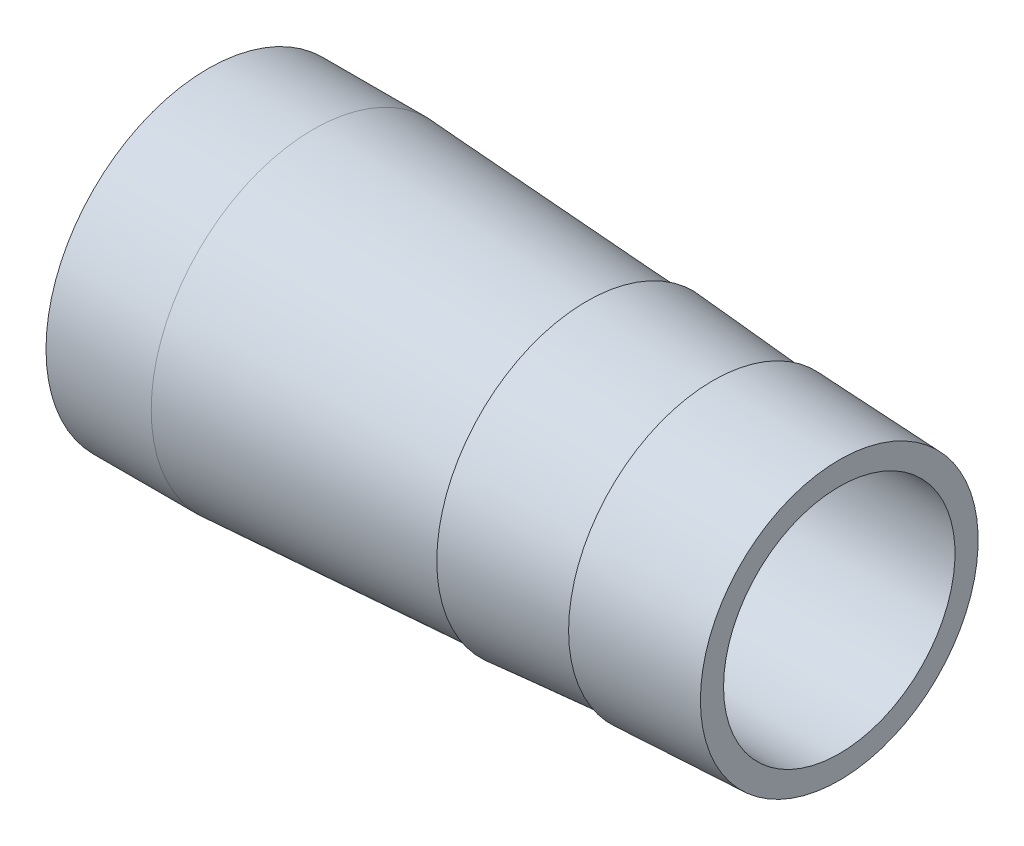
ISO-10303-21;
HEADER;
FILE_DESCRIPTION(('STEP AP214'),'2;1');
FILE_NAME('part.step','',(''),(''),'','','');
FILE_SCHEMA(('AUTOMOTIVE_DESIGN { 1 0 10303 214 1 1 1 1 }'));
ENDSEC;
DATA;
#1=APPLICATION_CONTEXT('core data for automotive mechanical design processes');
#2=APPLICATION_PROTOCOL_DEFINITION('international standard','automotive_design',2000,#1);
#3=PRODUCT_CONTEXT('',#1,'mechanical');
#4=PRODUCT('Part','Part','',(#3));
#5=PRODUCT_RELATED_PRODUCT_CATEGORY('part','',(#4));
#6=PRODUCT_DEFINITION_FORMATION('','',#4);
#7=PRODUCT_DEFINITION_CONTEXT('part definition',#1,'design');
#8=PRODUCT_DEFINITION('design','',#6,#7);
#9=PRODUCT_DEFINITION_SHAPE('','',#8);
#10=(LENGTH_UNIT() NAMED_UNIT(*) SI_UNIT(.MILLI.,.METRE.));
#11=(NAMED_UNIT(*) PLANE_ANGLE_UNIT() SI_UNIT($,.RADIAN.));
#12=(NAMED_UNIT(*) SI_UNIT($,.STERADIAN.) SOLID_ANGLE_UNIT());
#13=UNCERTAINTY_MEASURE_WITH_UNIT(LENGTH_MEASURE(1.E-05),#10,'distance_accuracy_value','');
#14=(GEOMETRIC_REPRESENTATION_CONTEXT(3) GLOBAL_UNCERTAINTY_ASSIGNED_CONTEXT((#13)) GLOBAL_UNIT_ASSIGNED_CONTEXT((#10,
#11,#12)) REPRESENTATION_CONTEXT('',''));
#15=CARTESIAN_POINT('',(0.,0.,0.));
#16=DIRECTION('',(0.,0.,1.));
#17=DIRECTION('',(1.,0.,0.));
#18=AXIS2_PLACEMENT_3D('',#15,#16,#17);
#19=CARTESIAN_POINT('',(13.0257491022955,6.6,0.));
#20=DIRECTION('',(-1.,0.,0.));
#21=DIRECTION('',(0.,0.,1.));
#22=AXIS2_PLACEMENT_3D('',#19,#20,#21);
#23=PLANE('',#22);
#24=CARTESIAN_POINT('',(13.0257491022955,0.,0.));
#25=DIRECTION('',(-1.,0.,0.));
#26=DIRECTION('',(0.,0.,1.));
#27=AXIS2_PLACEMENT_3D('',#24,#25,#26);
#28=CIRCLE('',#27,6.6);
#29=CARTESIAN_POINT('',(13.0257491022955,0.,6.6));
#30=VERTEX_POINT('',#29);
#31=EDGE_CURVE('E10',#30,#30,#28,.T.);
#32=ORIENTED_EDGE('',*,*,#31,.F.);
#33=EDGE_LOOP('',(#32));
#34=FACE_BOUND('',#33,.T.);
#35=CARTESIAN_POINT('',(13.0257491022955,0.,0.));
#36=DIRECTION('',(-1.,0.,0.));
#37=DIRECTION('',(0.,0.,1.));
#38=AXIS2_PLACEMENT_3D('',#35,#36,#37);
#39=CIRCLE('',#38,5.5);
#40=CARTESIAN_POINT('',(13.0257491022955,0.,5.5));
#41=VERTEX_POINT('',#40);
#42=EDGE_CURVE('E63',#41,#41,#39,.T.);
#43=ORIENTED_EDGE('',*,*,#42,.T.);
#44=EDGE_LOOP('',(#43));
#45=FACE_BOUND('',#44,.T.);
#46=ADVANCED_FACE('F32',(#34,#45),#23,.F.);
#47=CARTESIAN_POINT('',(13.0257491022955,0.,0.));
#48=DIRECTION('',(-1.,0.,0.));
#49=DIRECTION('',(0.,0.,1.));
#50=AXIS2_PLACEMENT_3D('',#47,#48,#49);
#51=CONICAL_SURFACE('',#50,6.6,0.0439716382710355);
#52=CARTESIAN_POINT('',(7.0257491022955,0.,0.));
#53=DIRECTION('',(-1.,0.,0.));
#54=DIRECTION('',(0.,0.,1.));
#55=AXIS2_PLACEMENT_3D('',#52,#53,#54);
#56=CIRCLE('',#55,6.864);
#57=CARTESIAN_POINT('',(7.0257491022955,0.,6.864));
#58=VERTEX_POINT('',#57);
#59=EDGE_CURVE('E38',#58,#58,#56,.T.);
#60=ORIENTED_EDGE('',*,*,#59,.F.);
#61=EDGE_LOOP('',(#60));
#62=FACE_BOUND('',#61,.T.);
#63=ORIENTED_EDGE('',*,*,#31,.T.);
#64=EDGE_LOOP('',(#63));
#65=FACE_BOUND('',#64,.T.);
#66=ADVANCED_FACE('F106',(#62,#65),#51,.T.);
#67=CARTESIAN_POINT('',(7.0257491022955,6.864,0.));
#68=DIRECTION('',(1.,0.,0.));
#69=DIRECTION('',(0.,0.,-1.));
#70=AXIS2_PLACEMENT_3D('',#67,#68,#69);
#71=PLANE('',#70);
#72=CARTESIAN_POINT('',(7.0257491022955,0.,0.));
#73=DIRECTION('',(-1.,0.,0.));
#74=DIRECTION('',(0.,0.,1.));
#75=AXIS2_PLACEMENT_3D('',#72,#73,#74);
#76=CIRCLE('',#75,6.6637328980487);
#77=CARTESIAN_POINT('',(7.0257491022955,0.,6.6637328980487));
#78=VERTEX_POINT('',#77);
#79=EDGE_CURVE('E42',#78,#78,#76,.T.);
#80=ORIENTED_EDGE('',*,*,#79,.F.);
#81=EDGE_LOOP('',(#80));
#82=FACE_BOUND('',#81,.T.);
#83=ORIENTED_EDGE('',*,*,#59,.T.);
#84=EDGE_LOOP('',(#83));
#85=FACE_BOUND('',#84,.T.);
#86=ADVANCED_FACE('F101',(#82,#85),#71,.F.);
#87=CARTESIAN_POINT('',(7.0257491022955,0.,0.));
#88=DIRECTION('',(-1.,0.,0.));
#89=DIRECTION('',(0.,0.,1.));
#90=AXIS2_PLACEMENT_3D('',#87,#88,#89);
#91=CONICAL_SURFACE('',#90,6.6637328980487,0.0772239737814798);
#92=CARTESIAN_POINT('',(1.02574910229549,0.,0.));
#93=DIRECTION('',(-1.,0.,0.));
#94=DIRECTION('',(0.,0.,1.));
#95=AXIS2_PLACEMENT_3D('',#92,#93,#94);
#96=CIRCLE('',#95,7.128);
#97=CARTESIAN_POINT('',(1.02574910229549,0.,7.128));
#98=VERTEX_POINT('',#97);
#99=EDGE_CURVE('E46',#98,#98,#96,.T.);
#100=ORIENTED_EDGE('',*,*,#99,.F.);
#101=EDGE_LOOP('',(#100));
#102=FACE_BOUND('',#101,.T.);
#103=ORIENTED_EDGE('',*,*,#79,.T.);
#104=EDGE_LOOP('',(#103));
#105=FACE_BOUND('',#104,.T.);
#106=ADVANCED_FACE('F95',(#102,#105),#91,.T.);
#107=CARTESIAN_POINT('',(1.02574910229549,7.128,0.));
#108=DIRECTION('',(1.,0.,0.));
#109=DIRECTION('',(0.,0.,-1.));
#110=AXIS2_PLACEMENT_3D('',#107,#108,#109);
#111=PLANE('',#110);
#112=CARTESIAN_POINT('',(1.02574910229549,0.,0.));
#113=DIRECTION('',(-1.,0.,0.));
#114=DIRECTION('',(0.,0.,1.));
#115=AXIS2_PLACEMENT_3D('',#112,#113,#114);
#116=CIRCLE('',#115,6.9329929625074);
#117=CARTESIAN_POINT('',(1.02574910229549,0.,6.9329929625074));
#118=VERTEX_POINT('',#117);
#119=EDGE_CURVE('E51',#118,#118,#116,.T.);
#120=ORIENTED_EDGE('',*,*,#119,.F.);
#121=EDGE_LOOP('',(#120));
#122=FACE_BOUND('',#121,.T.);
#123=ORIENTED_EDGE('',*,*,#99,.T.);
#124=EDGE_LOOP('',(#123));
#125=FACE_BOUND('',#124,.T.);
#126=ADVANCED_FACE('F89',(#122,#125),#111,.F.);
#127=CARTESIAN_POINT('',(1.02574910229549,0.,0.));
#128=DIRECTION('',(-1.,0.,0.));
#129=DIRECTION('',(0.,0.,1.));
#130=AXIS2_PLACEMENT_3D('',#127,#128,#129);
#131=CONICAL_SURFACE('',#130,6.9329929625074,0.0589322224313118);
#132=CARTESIAN_POINT('',(-11.9742508977045,0.,0.));
#133=DIRECTION('',(-1.,0.,0.));
#134=DIRECTION('',(0.,0.,1.));
#135=AXIS2_PLACEMENT_3D('',#132,#133,#134);
#136=CIRCLE('',#135,7.7);
#137=CARTESIAN_POINT('',(-11.9742508977045,0.,7.7));
#138=VERTEX_POINT('',#137);
#139=EDGE_CURVE('E54',#138,#138,#136,.T.);
#140=ORIENTED_EDGE('',*,*,#139,.F.);
#141=EDGE_LOOP('',(#140));
#142=FACE_BOUND('',#141,.T.);
#143=ORIENTED_EDGE('',*,*,#119,.T.);
#144=EDGE_LOOP('',(#143));
#145=FACE_BOUND('',#144,.T.);
#146=ADVANCED_FACE('F83',(#142,#145),#131,.T.);
#147=CARTESIAN_POINT('',(-17.9942817344961,0.,0.));
#148=DIRECTION('',(-1.,0.,0.));
#149=DIRECTION('',(0.,0.,1.));
#150=AXIS2_PLACEMENT_3D('',#147,#148,#149);
#151=CYLINDRICAL_SURFACE('',#150,7.7);
#152=CARTESIAN_POINT('',(-16.9742508977045,0.,0.));
#153=DIRECTION('',(-1.,0.,0.));
#154=DIRECTION('',(0.,0.,1.));
#155=AXIS2_PLACEMENT_3D('',#152,#153,#154);
#156=CIRCLE('',#155,7.7);
#157=CARTESIAN_POINT('',(-16.9742508977045,0.,7.7));
#158=VERTEX_POINT('',#157);
#159=EDGE_CURVE('E57',#158,#158,#156,.T.);
#160=ORIENTED_EDGE('',*,*,#159,.F.);
#161=EDGE_LOOP('',(#160));
#162=FACE_BOUND('',#161,.T.);
#163=ORIENTED_EDGE('',*,*,#139,.T.);
#164=EDGE_LOOP('',(#163));
#165=FACE_BOUND('',#164,.T.);
#166=ADVANCED_FACE('F77',(#162,#165),#151,.T.);
#167=CARTESIAN_POINT('',(-16.9742508977045,5.5,0.));
#168=DIRECTION('',(1.,0.,0.));
#169=DIRECTION('',(0.,0.,-1.));
#170=AXIS2_PLACEMENT_3D('',#167,#168,#169);
#171=PLANE('',#170);
#172=CARTESIAN_POINT('',(-16.9742508977045,0.,0.));
#173=DIRECTION('',(-1.,0.,0.));
#174=DIRECTION('',(0.,0.,1.));
#175=AXIS2_PLACEMENT_3D('',#172,#173,#174);
#176=CIRCLE('',#175,5.5);
#177=CARTESIAN_POINT('',(-16.9742508977045,0.,5.5));
#178=VERTEX_POINT('',#177);
#179=EDGE_CURVE('E60',#178,#178,#176,.T.);
#180=ORIENTED_EDGE('',*,*,#179,.F.);
#181=EDGE_LOOP('',(#180));
#182=FACE_BOUND('',#181,.T.);
#183=ORIENTED_EDGE('',*,*,#159,.T.);
#184=EDGE_LOOP('',(#183));
#185=FACE_BOUND('',#184,.T.);
#186=ADVANCED_FACE('F71',(#182,#185),#171,.F.);
#187=CARTESIAN_POINT('',(-17.9942817344961,0.,0.));
#188=DIRECTION('',(-1.,0.,0.));
#189=DIRECTION('',(0.,0.,1.));
#190=AXIS2_PLACEMENT_3D('',#187,#188,#189);
#191=CYLINDRICAL_SURFACE('',#190,5.5);
#192=ORIENTED_EDGE('',*,*,#42,.F.);
#193=EDGE_LOOP('',(#192));
#194=FACE_BOUND('',#193,.T.);
#195=ORIENTED_EDGE('',*,*,#179,.T.);
#196=EDGE_LOOP('',(#195));
#197=FACE_BOUND('',#196,.T.);
#198=ADVANCED_FACE('F68',(#194,#197),#191,.F.);
#199=CLOSED_SHELL('',(#46,#66,#86,#106,#126,#146,#166,#186,#198));
#200=MANIFOLD_SOLID_BREP('B2',#199);
#201=ADVANCED_BREP_SHAPE_REPRESENTATION('',(#18,#200),#14);
#202=SHAPE_DEFINITION_REPRESENTATION(#9,#201);
ENDSEC;
END-ISO-10303-21;
